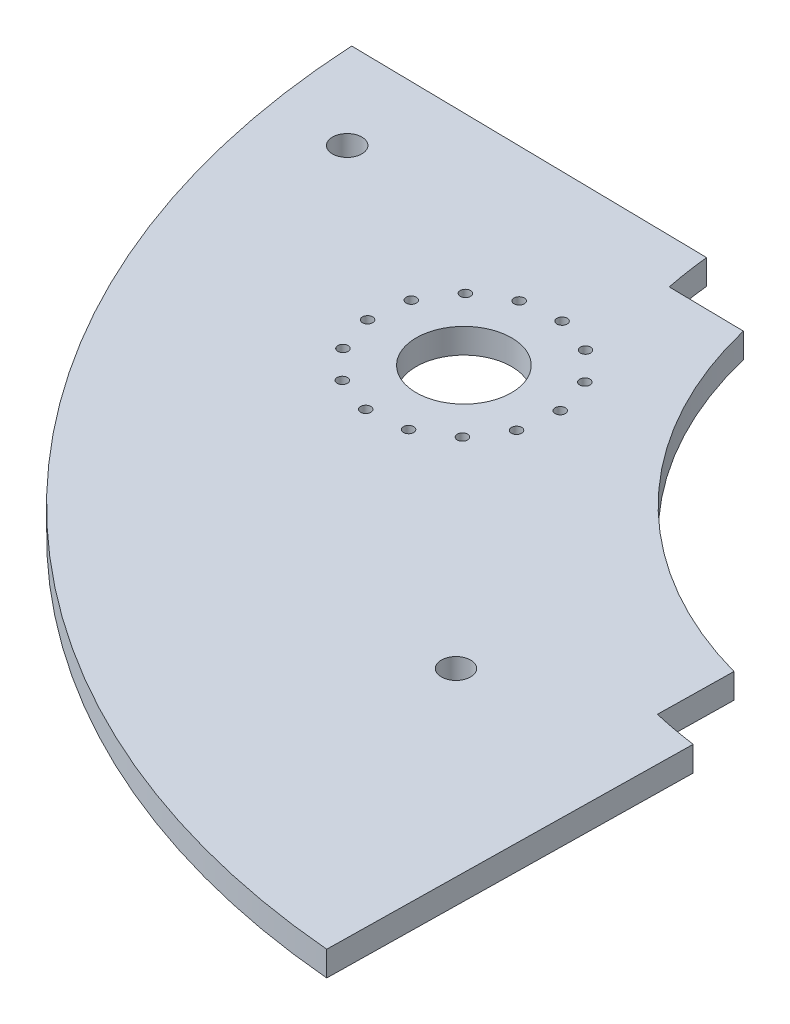
ISO-10303-21;
HEADER;
FILE_DESCRIPTION(('STEP AP214'),'2;1');
FILE_NAME('part.step','',(''),(''),'','','');
FILE_SCHEMA(('AUTOMOTIVE_DESIGN { 1 0 10303 214 1 1 1 1 }'));
ENDSEC;
DATA;
#1=APPLICATION_CONTEXT('core data for automotive mechanical design processes');
#2=APPLICATION_PROTOCOL_DEFINITION('international standard','automotive_design',2000,#1);
#3=PRODUCT_CONTEXT('',#1,'mechanical');
#4=PRODUCT('Part','Part','',(#3));
#5=PRODUCT_RELATED_PRODUCT_CATEGORY('part','',(#4));
#6=PRODUCT_DEFINITION_FORMATION('','',#4);
#7=PRODUCT_DEFINITION_CONTEXT('part definition',#1,'design');
#8=PRODUCT_DEFINITION('design','',#6,#7);
#9=PRODUCT_DEFINITION_SHAPE('','',#8);
#10=(LENGTH_UNIT() NAMED_UNIT(*) SI_UNIT(.MILLI.,.METRE.));
#11=(NAMED_UNIT(*) PLANE_ANGLE_UNIT() SI_UNIT($,.RADIAN.));
#12=(NAMED_UNIT(*) SI_UNIT($,.STERADIAN.) SOLID_ANGLE_UNIT());
#13=UNCERTAINTY_MEASURE_WITH_UNIT(LENGTH_MEASURE(1.E-05),#10,'distance_accuracy_value','');
#14=(GEOMETRIC_REPRESENTATION_CONTEXT(3) GLOBAL_UNCERTAINTY_ASSIGNED_CONTEXT((#13)) GLOBAL_UNIT_ASSIGNED_CONTEXT((#10,
#11,#12)) REPRESENTATION_CONTEXT('',''));
#15=CARTESIAN_POINT('',(0.,0.,0.));
#16=DIRECTION('',(0.,0.,1.));
#17=DIRECTION('',(1.,0.,0.));
#18=AXIS2_PLACEMENT_3D('',#15,#16,#17);
#19=CARTESIAN_POINT('',(4.07862578885082,1.7,-4.75361348173175));
#20=DIRECTION('',(0.,1.,0.));
#21=DIRECTION('',(0.,0.,1.));
#22=AXIS2_PLACEMENT_3D('',#19,#20,#21);
#23=PLANE('',#22);
#24=CARTESIAN_POINT('',(-13.0094951026305,1.7,31.5435437616723));
#25=DIRECTION('',(0.,1.,0.));
#26=DIRECTION('',(0.,0.,1.));
#27=AXIS2_PLACEMENT_3D('',#24,#25,#26);
#28=CIRCLE('',#27,0.999999999994745);
#29=CARTESIAN_POINT('',(-13.0094951026305,1.7,32.543543761667));
#30=VERTEX_POINT('',#29);
#31=EDGE_CURVE('E164',#30,#30,#28,.T.);
#32=ORIENTED_EDGE('',*,*,#31,.F.);
#33=EDGE_LOOP('',(#32));
#34=FACE_BOUND('',#33,.T.);
#35=CARTESIAN_POINT('',(-29.9103874160594,1.7,7.40792540677744));
#36=DIRECTION('',(0.,1.,0.));
#37=DIRECTION('',(0.,0.,-1.));
#38=AXIS2_PLACEMENT_3D('',#35,#36,#37);
#39=CIRCLE('',#38,0.350000000000004);
#40=CARTESIAN_POINT('',(-29.9103874160594,1.7,7.05792540677744));
#41=VERTEX_POINT('',#40);
#42=EDGE_CURVE('E181',#41,#41,#39,.T.);
#43=ORIENTED_EDGE('',*,*,#42,.F.);
#44=EDGE_LOOP('',(#43));
#45=FACE_BOUND('',#44,.T.);
#46=CARTESIAN_POINT('',(-34.8448738641863,1.7,9.06912309502029));
#47=DIRECTION('',(0.,1.,0.));
#48=DIRECTION('',(0.,0.,-1.));
#49=AXIS2_PLACEMENT_3D('',#46,#47,#48);
#50=CIRCLE('',#49,0.35);
#51=CARTESIAN_POINT('',(-34.8448738641863,1.7,8.71912309502029));
#52=VERTEX_POINT('',#51);
#53=EDGE_CURVE('E193',#52,#52,#50,.T.);
#54=ORIENTED_EDGE('',*,*,#53,.F.);
#55=EDGE_LOOP('',(#54));
#56=FACE_BOUND('',#55,.T.);
#57=CARTESIAN_POINT('',(-36.6226991907321,1.7,13.9627997674685));
#58=DIRECTION('',(0.,1.,0.));
#59=DIRECTION('',(0.,0.,-1.));
#60=AXIS2_PLACEMENT_3D('',#57,#58,#59);
#61=CIRCLE('',#60,0.349999999999987);
#62=CARTESIAN_POINT('',(-36.6226991907321,1.7,13.6127997674685));
#63=VERTEX_POINT('',#62);
#64=EDGE_CURVE('E205',#63,#63,#61,.T.);
#65=ORIENTED_EDGE('',*,*,#64,.F.);
#66=EDGE_LOOP('',(#65));
#67=FACE_BOUND('',#66,.T.);
#68=CARTESIAN_POINT('',(-33.9051246637802,1.7,18.4039170769564));
#69=DIRECTION('',(0.,1.,0.));
#70=DIRECTION('',(0.,0.,-1.));
#71=AXIS2_PLACEMENT_3D('',#68,#69,#70);
#72=CIRCLE('',#71,0.349999999999987);
#73=CARTESIAN_POINT('',(-33.9051246637802,1.7,18.0539170769564));
#74=VERTEX_POINT('',#73);
#75=EDGE_CURVE('E217',#74,#74,#72,.T.);
#76=ORIENTED_EDGE('',*,*,#75,.F.);
#77=EDGE_LOOP('',(#76));
#78=FACE_BOUND('',#77,.T.);
#79=CARTESIAN_POINT('',(-28.7385393305433,1.7,19.0482231071563));
#80=DIRECTION('',(0.,1.,0.));
#81=DIRECTION('',(0.,0.,-1.));
#82=AXIS2_PLACEMENT_3D('',#79,#80,#81);
#83=CIRCLE('',#82,0.350000000000003);
#84=CARTESIAN_POINT('',(-28.7385393305433,1.7,18.6982231071563));
#85=VERTEX_POINT('',#84);
#86=EDGE_CURVE('E229',#85,#85,#83,.T.);
#87=ORIENTED_EDGE('',*,*,#86,.F.);
#88=EDGE_LOOP('',(#87));
#89=FACE_BOUND('',#88,.T.);
#90=CARTESIAN_POINT('',(-25.0134873260829,1.7,15.4105422758798));
#91=DIRECTION('',(0.,1.,0.));
#92=DIRECTION('',(0.,0.,-1.));
#93=AXIS2_PLACEMENT_3D('',#90,#91,#92);
#94=CIRCLE('',#93,0.349999999999993);
#95=CARTESIAN_POINT('',(-25.0134873260829,1.7,15.0605422758798));
#96=VERTEX_POINT('',#95);
#97=EDGE_CURVE('E241',#96,#96,#94,.T.);
#98=ORIENTED_EDGE('',*,*,#97,.F.);
#99=EDGE_LOOP('',(#98));
#100=FACE_BOUND('',#99,.T.);
#101=CARTESIAN_POINT('',(-25.5350087869708,1.7,10.2301224442441));
#102=DIRECTION('',(0.,1.,0.));
#103=DIRECTION('',(0.,0.,-1.));
#104=AXIS2_PLACEMENT_3D('',#101,#102,#103);
#105=CIRCLE('',#104,0.350000000000001);
#106=CARTESIAN_POINT('',(-25.5350087869708,1.7,9.8801224442441));
#107=VERTEX_POINT('',#106);
#108=EDGE_CURVE('E253',#107,#107,#105,.T.);
#109=ORIENTED_EDGE('',*,*,#108,.F.);
#110=EDGE_LOOP('',(#109));
#111=FACE_BOUND('',#110,.T.);
#112=CARTESIAN_POINT('',(4.07862578885082,1.7,-4.75361348173175));
#113=DIRECTION('',(0.,1.,0.));
#114=DIRECTION('',(0.,0.,1.));
#115=AXIS2_PLACEMENT_3D('',#112,#113,#114);
#116=CIRCLE('',#115,57.5);
#117=CARTESIAN_POINT('',(-53.3385810768644,1.7,-1.66907855087679));
#118=VERTEX_POINT('',#117);
#119=CARTESIAN_POINT('',(-0.835821487659761,1.7,52.5359859929233));
#120=VERTEX_POINT('',#119);
#121=EDGE_CURVE('E150',#118,#120,#116,.T.);
#122=ORIENTED_EDGE('',*,*,#121,.T.);
#123=DIRECTION('',(0.0159509238825516,0.,-0.999872775920663));
#124=VECTOR('',#123,1.);
#125=CARTESIAN_POINT('',(-0.443364603551709,1.7,27.9350940927658));
#126=LINE('',#125,#124);
#127=CARTESIAN_POINT('',(-0.443364603551709,1.7,27.9350940927658));
#128=VERTEX_POINT('',#127);
#129=EDGE_CURVE('E97',#120,#128,#126,.T.);
#130=ORIENTED_EDGE('',*,*,#129,.T.);
#131=CARTESIAN_POINT('',(4.07862578885082,1.7,-4.75361348173175));
#132=DIRECTION('',(0.,-1.,0.));
#133=DIRECTION('',(0.,0.,1.));
#134=AXIS2_PLACEMENT_3D('',#131,#132,#133);
#135=CIRCLE('',#134,32.9999999999999);
#136=CARTESIAN_POINT('',(-3.43488548125061,1.7,27.3796581910073));
#137=VERTEX_POINT('',#136);
#138=EDGE_CURVE('E265',#128,#137,#135,.T.);
#139=ORIENTED_EDGE('',*,*,#138,.T.);
#140=DIRECTION('',(0.0159509238825519,0.,-0.999872775920663));
#141=VECTOR('',#140,1.);
#142=CARTESIAN_POINT('',(-3.362528612068,1.7,22.8440172350829));
#143=LINE('',#142,#141);
#144=CARTESIAN_POINT('',(-3.35292728046834,1.7,22.2421643173591));
#145=VERTEX_POINT('',#144);
#146=EDGE_CURVE('E267',#137,#145,#143,.T.);
#147=ORIENTED_EDGE('',*,*,#146,.T.);
#148=CARTESIAN_POINT('',(4.07862578885082,1.7,-4.75361348173175));
#149=DIRECTION('',(0.,-1.,0.));
#150=DIRECTION('',(0.,0.,1.));
#151=AXIS2_PLACEMENT_3D('',#148,#149,#150);
#152=CIRCLE('',#151,27.9999999999999);
#153=CARTESIAN_POINT('',(-23.1404649445951,1.7,1.81305231183759));
#154=VERTEX_POINT('',#153);
#155=EDGE_CURVE('E116',#145,#154,#152,.T.);
#156=ORIENTED_EDGE('',*,*,#155,.T.);
#157=DIRECTION('',(-0.999872775920664,0.,-0.0159509238825176));
#158=VECTOR('',#157,1.);
#159=CARTESIAN_POINT('',(-23.7423178623191,1.7,1.80345098023794));
#160=LINE('',#159,#158);
#161=CARTESIAN_POINT('',(-28.2779588182433,1.7,1.7310941110555));
#162=VERTEX_POINT('',#161);
#163=EDGE_CURVE('E110',#154,#162,#160,.T.);
#164=ORIENTED_EDGE('',*,*,#163,.T.);
#165=CARTESIAN_POINT('',(4.07862578885082,1.7,-4.75361348173175));
#166=DIRECTION('',(0.,-1.,0.));
#167=DIRECTION('',(0.,0.,1.));
#168=AXIS2_PLACEMENT_3D('',#165,#166,#167);
#169=CIRCLE('',#168,32.9999999999999);
#170=CARTESIAN_POINT('',(-28.7376891767068,1.7,-1.27662166676958));
#171=VERTEX_POINT('',#170);
#172=EDGE_CURVE('E114',#162,#171,#169,.T.);
#173=ORIENTED_EDGE('',*,*,#172,.T.);
#174=DIRECTION('',(-0.999872775920664,0.,-0.0159509238825177));
#175=VECTOR('',#174,1.);
#176=CARTESIAN_POINT('',(-53.3385810768644,1.7,-1.66907855087679));
#177=LINE('',#176,#175);
#178=EDGE_CURVE('E54',#171,#118,#177,.T.);
#179=ORIENTED_EDGE('',*,*,#178,.T.);
#180=EDGE_LOOP('',(#122,#130,#139,#147,#156,#164,#173,#179));
#181=FACE_BOUND('',#180,.T.);
#182=CARTESIAN_POINT('',(-27.4006240728926,1.7,8.31969811547301));
#183=DIRECTION('',(0.,1.,0.));
#184=DIRECTION('',(0.,0.,-1.));
#185=AXIS2_PLACEMENT_3D('',#182,#183,#184);
#186=CIRCLE('',#185,0.350000000000001);
#187=CARTESIAN_POINT('',(-27.4006240728926,1.7,7.96969811547301));
#188=VERTEX_POINT('',#187);
#189=EDGE_CURVE('E137',#188,#188,#186,.T.);
#190=ORIENTED_EDGE('',*,*,#189,.F.);
#191=EDGE_LOOP('',(#190));
#192=FACE_BOUND('',#191,.T.);
#193=CARTESIAN_POINT('',(-24.6830495459407,1.7,12.7608154249609));
#194=DIRECTION('',(0.,1.,0.));
#195=DIRECTION('',(0.,0.,-1.));
#196=AXIS2_PLACEMENT_3D('',#193,#194,#195);
#197=CIRCLE('',#196,0.350000000000004);
#198=CARTESIAN_POINT('',(-24.6830495459407,1.7,12.4108154249609));
#199=VERTEX_POINT('',#198);
#200=EDGE_CURVE('E247',#199,#199,#197,.T.);
#201=ORIENTED_EDGE('',*,*,#200,.F.);
#202=EDGE_LOOP('',(#201));
#203=FACE_BOUND('',#202,.T.);
#204=CARTESIAN_POINT('',(-26.4608748724866,1.7,17.6544920974091));
#205=DIRECTION('',(0.,1.,0.));
#206=DIRECTION('',(0.,0.,-1.));
#207=AXIS2_PLACEMENT_3D('',#204,#205,#206);
#208=CIRCLE('',#207,0.349999999999998);
#209=CARTESIAN_POINT('',(-26.4608748724866,1.7,17.3044920974091));
#210=VERTEX_POINT('',#209);
#211=EDGE_CURVE('E235',#210,#210,#208,.T.);
#212=ORIENTED_EDGE('',*,*,#211,.F.);
#213=EDGE_LOOP('',(#212));
#214=FACE_BOUND('',#213,.T.);
#215=CARTESIAN_POINT('',(-31.3953613206134,1.7,19.315689785652));
#216=DIRECTION('',(0.,1.,0.));
#217=DIRECTION('',(0.,0.,-1.));
#218=AXIS2_PLACEMENT_3D('',#215,#216,#217);
#219=CIRCLE('',#218,0.35);
#220=CARTESIAN_POINT('',(-31.3953613206134,1.7,18.965689785652));
#221=VERTEX_POINT('',#220);
#222=EDGE_CURVE('E223',#221,#221,#219,.T.);
#223=ORIENTED_EDGE('',*,*,#222,.F.);
#224=EDGE_LOOP('',(#223));
#225=FACE_BOUND('',#224,.T.);
#226=CARTESIAN_POINT('',(-35.770739949702,1.7,16.4934927481853));
#227=DIRECTION('',(0.,1.,0.));
#228=DIRECTION('',(0.,0.,-1.));
#229=AXIS2_PLACEMENT_3D('',#226,#227,#228);
#230=CIRCLE('',#229,0.35);
#231=CARTESIAN_POINT('',(-35.770739949702,1.7,16.1434927481853));
#232=VERTEX_POINT('',#231);
#233=EDGE_CURVE('E211',#232,#232,#230,.T.);
#234=ORIENTED_EDGE('',*,*,#233,.F.);
#235=EDGE_LOOP('',(#234));
#236=FACE_BOUND('',#235,.T.);
#237=CARTESIAN_POINT('',(-36.29226141059,1.7,11.3130729165496));
#238=DIRECTION('',(0.,1.,0.));
#239=DIRECTION('',(0.,0.,-1.));
#240=AXIS2_PLACEMENT_3D('',#237,#238,#239);
#241=CIRCLE('',#240,0.349999999999993);
#242=CARTESIAN_POINT('',(-36.29226141059,1.7,10.9630729165496));
#243=VERTEX_POINT('',#242);
#244=EDGE_CURVE('E199',#243,#243,#241,.T.);
#245=ORIENTED_EDGE('',*,*,#244,.F.);
#246=EDGE_LOOP('',(#245));
#247=FACE_BOUND('',#246,.T.);
#248=CARTESIAN_POINT('',(-32.5672094061295,1.7,7.67539208527307));
#249=DIRECTION('',(0.,1.,0.));
#250=DIRECTION('',(0.,0.,-1.));
#251=AXIS2_PLACEMENT_3D('',#248,#249,#250);
#252=CIRCLE('',#251,0.349999999999994);
#253=CARTESIAN_POINT('',(-32.5672094061295,1.7,7.32539208527307));
#254=VERTEX_POINT('',#253);
#255=EDGE_CURVE('E187',#254,#254,#252,.T.);
#256=ORIENTED_EDGE('',*,*,#255,.F.);
#257=EDGE_LOOP('',(#256));
#258=FACE_BOUND('',#257,.T.);
#259=CARTESIAN_POINT('',(-30.6528743683364,1.7,13.3618075962147));
#260=DIRECTION('',(0.,1.,0.));
#261=DIRECTION('',(0.,0.,-1.));
#262=AXIS2_PLACEMENT_3D('',#259,#260,#261);
#263=CIRCLE('',#262,3.25);
#264=CARTESIAN_POINT('',(-30.6528743683364,1.7,10.1118075962147));
#265=VERTEX_POINT('',#264);
#266=EDGE_CURVE('E168',#265,#265,#263,.T.);
#267=ORIENTED_EDGE('',*,*,#266,.F.);
#268=EDGE_LOOP('',(#267));
#269=FACE_BOUND('',#268,.T.);
#270=CARTESIAN_POINT('',(-47.6153672350513,1.7,4.36135761284235));
#271=DIRECTION('',(0.,1.,0.));
#272=DIRECTION('',(0.,0.,1.));
#273=AXIS2_PLACEMENT_3D('',#270,#271,#272);
#274=CIRCLE('',#273,0.999999999998277);
#275=CARTESIAN_POINT('',(-47.6153672350513,1.7,5.36135761284063));
#276=VERTEX_POINT('',#275);
#277=EDGE_CURVE('E175',#276,#276,#274,.T.);
#278=ORIENTED_EDGE('',*,*,#277,.F.);
#279=EDGE_LOOP('',(#278));
#280=FACE_BOUND('',#279,.T.);
#281=ADVANCED_FACE('F35',(#34,#45,#56,#67,#78,#89,#100,#111,#181,#192,#203,#214,#225,#236,#247,
#258,#269,#280),#23,.T.);
#282=CARTESIAN_POINT('',(4.07862578885082,0.,-4.75361348173175));
#283=DIRECTION('',(0.,1.,0.));
#284=DIRECTION('',(0.,0.,1.));
#285=AXIS2_PLACEMENT_3D('',#282,#283,#284);
#286=PLANE('',#285);
#287=CARTESIAN_POINT('',(-13.0094951026305,0.,31.5435437616723));
#288=DIRECTION('',(0.,1.,0.));
#289=DIRECTION('',(0.,0.,1.));
#290=AXIS2_PLACEMENT_3D('',#287,#288,#289);
#291=CIRCLE('',#290,0.999999999994745);
#292=CARTESIAN_POINT('',(-13.0094951026305,0.,32.543543761667));
#293=VERTEX_POINT('',#292);
#294=EDGE_CURVE('E161',#293,#293,#291,.F.);
#295=ORIENTED_EDGE('',*,*,#294,.F.);
#296=EDGE_LOOP('',(#295));
#297=FACE_BOUND('',#296,.T.);
#298=CARTESIAN_POINT('',(-29.9103874160594,0.,7.40792540677744));
#299=DIRECTION('',(0.,1.,0.));
#300=DIRECTION('',(0.,0.,-1.));
#301=AXIS2_PLACEMENT_3D('',#298,#299,#300);
#302=CIRCLE('',#301,0.350000000000004);
#303=CARTESIAN_POINT('',(-29.9103874160594,0.,7.05792540677744));
#304=VERTEX_POINT('',#303);
#305=EDGE_CURVE('E179',#304,#304,#302,.T.);
#306=ORIENTED_EDGE('',*,*,#305,.T.);
#307=EDGE_LOOP('',(#306));
#308=FACE_BOUND('',#307,.T.);
#309=CARTESIAN_POINT('',(-34.8448738641863,0.,9.06912309502029));
#310=DIRECTION('',(0.,1.,0.));
#311=DIRECTION('',(0.,0.,-1.));
#312=AXIS2_PLACEMENT_3D('',#309,#310,#311);
#313=CIRCLE('',#312,0.35);
#314=CARTESIAN_POINT('',(-34.8448738641863,0.,8.71912309502029));
#315=VERTEX_POINT('',#314);
#316=EDGE_CURVE('E190',#315,#315,#313,.T.);
#317=ORIENTED_EDGE('',*,*,#316,.T.);
#318=EDGE_LOOP('',(#317));
#319=FACE_BOUND('',#318,.T.);
#320=CARTESIAN_POINT('',(-36.6226991907321,0.,13.9627997674685));
#321=DIRECTION('',(0.,1.,0.));
#322=DIRECTION('',(0.,0.,-1.));
#323=AXIS2_PLACEMENT_3D('',#320,#321,#322);
#324=CIRCLE('',#323,0.349999999999987);
#325=CARTESIAN_POINT('',(-36.6226991907321,0.,13.6127997674685));
#326=VERTEX_POINT('',#325);
#327=EDGE_CURVE('E202',#326,#326,#324,.T.);
#328=ORIENTED_EDGE('',*,*,#327,.T.);
#329=EDGE_LOOP('',(#328));
#330=FACE_BOUND('',#329,.T.);
#331=CARTESIAN_POINT('',(-33.9051246637802,0.,18.4039170769564));
#332=DIRECTION('',(0.,1.,0.));
#333=DIRECTION('',(0.,0.,-1.));
#334=AXIS2_PLACEMENT_3D('',#331,#332,#333);
#335=CIRCLE('',#334,0.349999999999987);
#336=CARTESIAN_POINT('',(-33.9051246637802,0.,18.0539170769564));
#337=VERTEX_POINT('',#336);
#338=EDGE_CURVE('E214',#337,#337,#335,.T.);
#339=ORIENTED_EDGE('',*,*,#338,.T.);
#340=EDGE_LOOP('',(#339));
#341=FACE_BOUND('',#340,.T.);
#342=CARTESIAN_POINT('',(-28.7385393305433,0.,19.0482231071563));
#343=DIRECTION('',(0.,1.,0.));
#344=DIRECTION('',(0.,0.,-1.));
#345=AXIS2_PLACEMENT_3D('',#342,#343,#344);
#346=CIRCLE('',#345,0.350000000000003);
#347=CARTESIAN_POINT('',(-28.7385393305433,0.,18.6982231071563));
#348=VERTEX_POINT('',#347);
#349=EDGE_CURVE('E226',#348,#348,#346,.T.);
#350=ORIENTED_EDGE('',*,*,#349,.T.);
#351=EDGE_LOOP('',(#350));
#352=FACE_BOUND('',#351,.T.);
#353=CARTESIAN_POINT('',(-25.0134873260829,0.,15.4105422758798));
#354=DIRECTION('',(0.,1.,0.));
#355=DIRECTION('',(0.,0.,-1.));
#356=AXIS2_PLACEMENT_3D('',#353,#354,#355);
#357=CIRCLE('',#356,0.349999999999993);
#358=CARTESIAN_POINT('',(-25.0134873260829,0.,15.0605422758798));
#359=VERTEX_POINT('',#358);
#360=EDGE_CURVE('E238',#359,#359,#357,.T.);
#361=ORIENTED_EDGE('',*,*,#360,.T.);
#362=EDGE_LOOP('',(#361));
#363=FACE_BOUND('',#362,.T.);
#364=CARTESIAN_POINT('',(-25.5350087869708,0.,10.2301224442441));
#365=DIRECTION('',(0.,1.,0.));
#366=DIRECTION('',(0.,0.,-1.));
#367=AXIS2_PLACEMENT_3D('',#364,#365,#366);
#368=CIRCLE('',#367,0.350000000000001);
#369=CARTESIAN_POINT('',(-25.5350087869708,0.,9.8801224442441));
#370=VERTEX_POINT('',#369);
#371=EDGE_CURVE('E250',#370,#370,#368,.T.);
#372=ORIENTED_EDGE('',*,*,#371,.T.);
#373=EDGE_LOOP('',(#372));
#374=FACE_BOUND('',#373,.T.);
#375=CARTESIAN_POINT('',(4.07862578885082,0.,-4.75361348173175));
#376=DIRECTION('',(0.,1.,0.));
#377=DIRECTION('',(0.,0.,1.));
#378=AXIS2_PLACEMENT_3D('',#375,#376,#377);
#379=CIRCLE('',#378,57.5);
#380=CARTESIAN_POINT('',(-53.3385810768644,0.,-1.66907855087679));
#381=VERTEX_POINT('',#380);
#382=CARTESIAN_POINT('',(-0.835821487659761,0.,52.5359859929233));
#383=VERTEX_POINT('',#382);
#384=EDGE_CURVE('E133',#381,#383,#379,.T.);
#385=ORIENTED_EDGE('',*,*,#384,.F.);
#386=DIRECTION('',(-0.999872775920664,0.,-0.0159509238825177));
#387=VECTOR('',#386,1.);
#388=CARTESIAN_POINT('',(-53.3385810768644,0.,-1.66907855087679));
#389=LINE('',#388,#387);
#390=CARTESIAN_POINT('',(-28.7376891767068,0.,-1.27662166676958));
#391=VERTEX_POINT('',#390);
#392=EDGE_CURVE('E89',#391,#381,#389,.T.);
#393=ORIENTED_EDGE('',*,*,#392,.F.);
#394=CARTESIAN_POINT('',(4.07862578885082,0.,-4.75361348173175));
#395=DIRECTION('',(0.,-1.,0.));
#396=DIRECTION('',(0.,0.,1.));
#397=AXIS2_PLACEMENT_3D('',#394,#395,#396);
#398=CIRCLE('',#397,32.9999999999999);
#399=CARTESIAN_POINT('',(-28.2779588182433,0.,1.7310941110555));
#400=VERTEX_POINT('',#399);
#401=EDGE_CURVE('E83',#400,#391,#398,.T.);
#402=ORIENTED_EDGE('',*,*,#401,.F.);
#403=DIRECTION('',(-0.999872775920664,0.,-0.0159509238825177));
#404=VECTOR('',#403,1.);
#405=CARTESIAN_POINT('',(-28.2779588182433,0.,1.7310941110555));
#406=LINE('',#405,#404);
#407=CARTESIAN_POINT('',(-23.1404649445951,0.,1.81305231183759));
#408=VERTEX_POINT('',#407);
#409=EDGE_CURVE('E123',#408,#400,#406,.T.);
#410=ORIENTED_EDGE('',*,*,#409,.F.);
#411=CARTESIAN_POINT('',(4.07862578885082,0.,-4.75361348173175));
#412=DIRECTION('',(0.,-1.,0.));
#413=DIRECTION('',(0.,0.,1.));
#414=AXIS2_PLACEMENT_3D('',#411,#412,#413);
#415=CIRCLE('',#414,27.9999999999999);
#416=CARTESIAN_POINT('',(-3.35292728046834,0.,22.2421643173591));
#417=VERTEX_POINT('',#416);
#418=EDGE_CURVE('E144',#417,#408,#415,.T.);
#419=ORIENTED_EDGE('',*,*,#418,.F.);
#420=DIRECTION('',(0.0159509238825209,0.,-0.999872775920664));
#421=VECTOR('',#420,1.);
#422=CARTESIAN_POINT('',(-3.362528612068,0.,22.8440172350829));
#423=LINE('',#422,#421);
#424=CARTESIAN_POINT('',(-3.43488548125061,0.,27.3796581910073));
#425=VERTEX_POINT('',#424);
#426=EDGE_CURVE('E142',#425,#417,#423,.T.);
#427=ORIENTED_EDGE('',*,*,#426,.F.);
#428=CARTESIAN_POINT('',(4.07862578885082,0.,-4.75361348173175));
#429=DIRECTION('',(0.,-1.,0.));
#430=DIRECTION('',(0.,0.,1.));
#431=AXIS2_PLACEMENT_3D('',#428,#429,#430);
#432=CIRCLE('',#431,32.9999999999999);
#433=CARTESIAN_POINT('',(-0.443364603551709,0.,27.9350940927658));
#434=VERTEX_POINT('',#433);
#435=EDGE_CURVE('E139',#434,#425,#432,.T.);
#436=ORIENTED_EDGE('',*,*,#435,.F.);
#437=DIRECTION('',(0.0159509238825516,0.,-0.999872775920663));
#438=VECTOR('',#437,1.);
#439=CARTESIAN_POINT('',(-0.443364603551709,0.,27.9350940927658));
#440=LINE('',#439,#438);
#441=EDGE_CURVE('E136',#383,#434,#440,.T.);
#442=ORIENTED_EDGE('',*,*,#441,.F.);
#443=EDGE_LOOP('',(#385,#393,#402,#410,#419,#427,#436,#442));
#444=FACE_BOUND('',#443,.T.);
#445=CARTESIAN_POINT('',(-27.4006240728926,0.,8.31969811547301));
#446=DIRECTION('',(0.,1.,0.));
#447=DIRECTION('',(0.,0.,-1.));
#448=AXIS2_PLACEMENT_3D('',#445,#446,#447);
#449=CIRCLE('',#448,0.350000000000001);
#450=CARTESIAN_POINT('',(-27.4006240728926,0.,7.96969811547301));
#451=VERTEX_POINT('',#450);
#452=EDGE_CURVE('E256',#451,#451,#449,.T.);
#453=ORIENTED_EDGE('',*,*,#452,.T.);
#454=EDGE_LOOP('',(#453));
#455=FACE_BOUND('',#454,.T.);
#456=CARTESIAN_POINT('',(-24.6830495459407,0.,12.7608154249609));
#457=DIRECTION('',(0.,1.,0.));
#458=DIRECTION('',(0.,0.,-1.));
#459=AXIS2_PLACEMENT_3D('',#456,#457,#458);
#460=CIRCLE('',#459,0.350000000000004);
#461=CARTESIAN_POINT('',(-24.6830495459407,0.,12.4108154249609));
#462=VERTEX_POINT('',#461);
#463=EDGE_CURVE('E244',#462,#462,#460,.T.);
#464=ORIENTED_EDGE('',*,*,#463,.T.);
#465=EDGE_LOOP('',(#464));
#466=FACE_BOUND('',#465,.T.);
#467=CARTESIAN_POINT('',(-26.4608748724866,0.,17.6544920974091));
#468=DIRECTION('',(0.,1.,0.));
#469=DIRECTION('',(0.,0.,-1.));
#470=AXIS2_PLACEMENT_3D('',#467,#468,#469);
#471=CIRCLE('',#470,0.349999999999998);
#472=CARTESIAN_POINT('',(-26.4608748724866,0.,17.3044920974091));
#473=VERTEX_POINT('',#472);
#474=EDGE_CURVE('E232',#473,#473,#471,.T.);
#475=ORIENTED_EDGE('',*,*,#474,.T.);
#476=EDGE_LOOP('',(#475));
#477=FACE_BOUND('',#476,.T.);
#478=CARTESIAN_POINT('',(-31.3953613206134,0.,19.315689785652));
#479=DIRECTION('',(0.,1.,0.));
#480=DIRECTION('',(0.,0.,-1.));
#481=AXIS2_PLACEMENT_3D('',#478,#479,#480);
#482=CIRCLE('',#481,0.35);
#483=CARTESIAN_POINT('',(-31.3953613206134,0.,18.965689785652));
#484=VERTEX_POINT('',#483);
#485=EDGE_CURVE('E220',#484,#484,#482,.T.);
#486=ORIENTED_EDGE('',*,*,#485,.T.);
#487=EDGE_LOOP('',(#486));
#488=FACE_BOUND('',#487,.T.);
#489=CARTESIAN_POINT('',(-35.770739949702,0.,16.4934927481853));
#490=DIRECTION('',(0.,1.,0.));
#491=DIRECTION('',(0.,0.,-1.));
#492=AXIS2_PLACEMENT_3D('',#489,#490,#491);
#493=CIRCLE('',#492,0.35);
#494=CARTESIAN_POINT('',(-35.770739949702,0.,16.1434927481853));
#495=VERTEX_POINT('',#494);
#496=EDGE_CURVE('E208',#495,#495,#493,.T.);
#497=ORIENTED_EDGE('',*,*,#496,.T.);
#498=EDGE_LOOP('',(#497));
#499=FACE_BOUND('',#498,.T.);
#500=CARTESIAN_POINT('',(-36.29226141059,0.,11.3130729165496));
#501=DIRECTION('',(0.,1.,0.));
#502=DIRECTION('',(0.,0.,-1.));
#503=AXIS2_PLACEMENT_3D('',#500,#501,#502);
#504=CIRCLE('',#503,0.349999999999993);
#505=CARTESIAN_POINT('',(-36.29226141059,0.,10.9630729165496));
#506=VERTEX_POINT('',#505);
#507=EDGE_CURVE('E196',#506,#506,#504,.T.);
#508=ORIENTED_EDGE('',*,*,#507,.T.);
#509=EDGE_LOOP('',(#508));
#510=FACE_BOUND('',#509,.T.);
#511=CARTESIAN_POINT('',(-32.5672094061295,0.,7.67539208527307));
#512=DIRECTION('',(0.,1.,0.));
#513=DIRECTION('',(0.,0.,-1.));
#514=AXIS2_PLACEMENT_3D('',#511,#512,#513);
#515=CIRCLE('',#514,0.349999999999994);
#516=CARTESIAN_POINT('',(-32.5672094061295,0.,7.32539208527307));
#517=VERTEX_POINT('',#516);
#518=EDGE_CURVE('E184',#517,#517,#515,.T.);
#519=ORIENTED_EDGE('',*,*,#518,.T.);
#520=EDGE_LOOP('',(#519));
#521=FACE_BOUND('',#520,.T.);
#522=CARTESIAN_POINT('',(-30.6528743683364,0.,13.3618075962147));
#523=DIRECTION('',(0.,1.,0.));
#524=DIRECTION('',(0.,0.,-1.));
#525=AXIS2_PLACEMENT_3D('',#522,#523,#524);
#526=CIRCLE('',#525,3.25);
#527=CARTESIAN_POINT('',(-30.6528743683364,0.,10.1118075962147));
#528=VERTEX_POINT('',#527);
#529=EDGE_CURVE('E163',#528,#528,#526,.T.);
#530=ORIENTED_EDGE('',*,*,#529,.T.);
#531=EDGE_LOOP('',(#530));
#532=FACE_BOUND('',#531,.T.);
#533=CARTESIAN_POINT('',(-47.6153672350513,0.,4.36135761284235));
#534=DIRECTION('',(0.,1.,0.));
#535=DIRECTION('',(0.,0.,1.));
#536=AXIS2_PLACEMENT_3D('',#533,#534,#535);
#537=CIRCLE('',#536,0.999999999998277);
#538=CARTESIAN_POINT('',(-47.6153672350513,0.,5.36135761284063));
#539=VERTEX_POINT('',#538);
#540=EDGE_CURVE('E39',#539,#539,#537,.F.);
#541=ORIENTED_EDGE('',*,*,#540,.F.);
#542=EDGE_LOOP('',(#541));
#543=FACE_BOUND('',#542,.T.);
#544=ADVANCED_FACE('F279',(#297,#308,#319,#330,#341,#352,#363,#374,#444,#455,#466,#477,#488,
#499,#510,#521,#532,#543),#286,.F.);
#545=CARTESIAN_POINT('',(4.07862578885082,1.7,-4.75361348173175));
#546=DIRECTION('',(0.,-1.,0.));
#547=DIRECTION('',(0.,0.,-1.));
#548=AXIS2_PLACEMENT_3D('',#545,#546,#547);
#549=CYLINDRICAL_SURFACE('',#548,57.5);
#550=ORIENTED_EDGE('',*,*,#384,.T.);
#551=DIRECTION('',(0.,-1.,0.));
#552=VECTOR('',#551,1.);
#553=CARTESIAN_POINT('',(-0.835821487659761,1.7,52.5359859929233));
#554=LINE('',#553,#552);
#555=EDGE_CURVE('E11',#120,#383,#554,.T.);
#556=ORIENTED_EDGE('',*,*,#555,.F.);
#557=ORIENTED_EDGE('',*,*,#121,.F.);
#558=DIRECTION('',(0.,-1.,0.));
#559=VECTOR('',#558,1.);
#560=CARTESIAN_POINT('',(-53.3385810768644,1.7,-1.66907855087679));
#561=LINE('',#560,#559);
#562=EDGE_CURVE('E129',#118,#381,#561,.T.);
#563=ORIENTED_EDGE('',*,*,#562,.T.);
#564=EDGE_LOOP('',(#550,#556,#557,#563));
#565=FACE_BOUND('',#564,.T.);
#566=ADVANCED_FACE('F37',(#565),#549,.T.);
#567=CARTESIAN_POINT('',(-0.443364603551709,1.7,27.9350940927658));
#568=DIRECTION('',(-0.999872775920663,0.,-0.0159509238825516));
#569=DIRECTION('',(-0.0159509238825516,0.,0.999872775920663));
#570=AXIS2_PLACEMENT_3D('',#567,#568,#569);
#571=PLANE('',#570);
#572=ORIENTED_EDGE('',*,*,#441,.T.);
#573=DIRECTION('',(0.,-1.,0.));
#574=VECTOR('',#573,1.);
#575=CARTESIAN_POINT('',(-0.443364603551709,1.7,27.9350940927658));
#576=LINE('',#575,#574);
#577=EDGE_CURVE('E45',#128,#434,#576,.T.);
#578=ORIENTED_EDGE('',*,*,#577,.F.);
#579=ORIENTED_EDGE('',*,*,#129,.F.);
#580=ORIENTED_EDGE('',*,*,#555,.T.);
#581=EDGE_LOOP('',(#572,#578,#579,#580));
#582=FACE_BOUND('',#581,.T.);
#583=ADVANCED_FACE('F487',(#582),#571,.F.);
#584=CARTESIAN_POINT('',(4.07862578885082,1.7,-4.75361348173175));
#585=DIRECTION('',(0.,-1.,0.));
#586=DIRECTION('',(0.,0.,-1.));
#587=AXIS2_PLACEMENT_3D('',#584,#585,#586);
#588=CYLINDRICAL_SURFACE('',#587,32.9999999999999);
#589=ORIENTED_EDGE('',*,*,#435,.T.);
#590=DIRECTION('',(0.,-1.,0.));
#591=VECTOR('',#590,1.);
#592=CARTESIAN_POINT('',(-3.43488548125061,1.7,27.3796581910073));
#593=LINE('',#592,#591);
#594=EDGE_CURVE('E157',#137,#425,#593,.T.);
#595=ORIENTED_EDGE('',*,*,#594,.F.);
#596=ORIENTED_EDGE('',*,*,#138,.F.);
#597=ORIENTED_EDGE('',*,*,#577,.T.);
#598=EDGE_LOOP('',(#589,#595,#596,#597));
#599=FACE_BOUND('',#598,.T.);
#600=ADVANCED_FACE('F477',(#599),#588,.F.);
#601=CARTESIAN_POINT('',(-3.362528612068,1.7,22.8440172350829));
#602=DIRECTION('',(-0.999872775920664,0.,-0.0159509238825209));
#603=DIRECTION('',(-0.0159509238825209,0.,0.999872775920664));
#604=AXIS2_PLACEMENT_3D('',#601,#602,#603);
#605=PLANE('',#604);
#606=ORIENTED_EDGE('',*,*,#426,.T.);
#607=DIRECTION('',(0.,-1.,0.));
#608=VECTOR('',#607,1.);
#609=CARTESIAN_POINT('',(-3.35292728046834,1.7,22.2421643173591));
#610=LINE('',#609,#608);
#611=EDGE_CURVE('E154',#145,#417,#610,.T.);
#612=ORIENTED_EDGE('',*,*,#611,.F.);
#613=ORIENTED_EDGE('',*,*,#146,.F.);
#614=ORIENTED_EDGE('',*,*,#594,.T.);
#615=EDGE_LOOP('',(#606,#612,#613,#614));
#616=FACE_BOUND('',#615,.T.);
#617=ADVANCED_FACE('F273',(#616),#605,.F.);
#618=CARTESIAN_POINT('',(4.07862578885082,1.7,-4.75361348173175));
#619=DIRECTION('',(0.,-1.,0.));
#620=DIRECTION('',(0.,0.,-1.));
#621=AXIS2_PLACEMENT_3D('',#618,#619,#620);
#622=CYLINDRICAL_SURFACE('',#621,27.9999999999999);
#623=ORIENTED_EDGE('',*,*,#418,.T.);
#624=DIRECTION('',(0.,-1.,0.));
#625=VECTOR('',#624,1.);
#626=CARTESIAN_POINT('',(-23.1404649445951,1.7,1.81305231183759));
#627=LINE('',#626,#625);
#628=EDGE_CURVE('E124',#154,#408,#627,.T.);
#629=ORIENTED_EDGE('',*,*,#628,.F.);
#630=ORIENTED_EDGE('',*,*,#155,.F.);
#631=ORIENTED_EDGE('',*,*,#611,.T.);
#632=EDGE_LOOP('',(#623,#629,#630,#631));
#633=FACE_BOUND('',#632,.T.);
#634=ADVANCED_FACE('F276',(#633),#622,.F.);
#635=CARTESIAN_POINT('',(-28.2779588182433,1.7,1.7310941110555));
#636=DIRECTION('',(-0.0159509238825177,0.,0.999872775920664));
#637=DIRECTION('',(0.999872775920664,0.,0.0159509238825177));
#638=AXIS2_PLACEMENT_3D('',#635,#636,#637);
#639=PLANE('',#638);
#640=ORIENTED_EDGE('',*,*,#409,.T.);
#641=DIRECTION('',(0.,-1.,0.));
#642=VECTOR('',#641,1.);
#643=CARTESIAN_POINT('',(-28.2779588182433,1.7,1.7310941110555));
#644=LINE('',#643,#642);
#645=EDGE_CURVE('E121',#162,#400,#644,.T.);
#646=ORIENTED_EDGE('',*,*,#645,.F.);
#647=ORIENTED_EDGE('',*,*,#163,.F.);
#648=ORIENTED_EDGE('',*,*,#628,.T.);
#649=EDGE_LOOP('',(#640,#646,#647,#648));
#650=FACE_BOUND('',#649,.T.);
#651=ADVANCED_FACE('F122',(#650),#639,.F.);
#652=CARTESIAN_POINT('',(4.07862578885082,1.7,-4.75361348173175));
#653=DIRECTION('',(0.,-1.,0.));
#654=DIRECTION('',(0.,0.,-1.));
#655=AXIS2_PLACEMENT_3D('',#652,#653,#654);
#656=CYLINDRICAL_SURFACE('',#655,32.9999999999999);
#657=ORIENTED_EDGE('',*,*,#401,.T.);
#658=DIRECTION('',(0.,-1.,0.));
#659=VECTOR('',#658,1.);
#660=CARTESIAN_POINT('',(-28.7376891767068,1.7,-1.27662166676958));
#661=LINE('',#660,#659);
#662=EDGE_CURVE('E125',#171,#391,#661,.T.);
#663=ORIENTED_EDGE('',*,*,#662,.F.);
#664=ORIENTED_EDGE('',*,*,#172,.F.);
#665=ORIENTED_EDGE('',*,*,#645,.T.);
#666=EDGE_LOOP('',(#657,#663,#664,#665));
#667=FACE_BOUND('',#666,.T.);
#668=ADVANCED_FACE('F127',(#667),#656,.F.);
#669=CARTESIAN_POINT('',(-53.3385810768644,1.7,-1.66907855087679));
#670=DIRECTION('',(-0.0159509238825177,0.,0.999872775920664));
#671=DIRECTION('',(0.999872775920664,0.,0.0159509238825177));
#672=AXIS2_PLACEMENT_3D('',#669,#670,#671);
#673=PLANE('',#672);
#674=ORIENTED_EDGE('',*,*,#392,.T.);
#675=ORIENTED_EDGE('',*,*,#562,.F.);
#676=ORIENTED_EDGE('',*,*,#178,.F.);
#677=ORIENTED_EDGE('',*,*,#662,.T.);
#678=EDGE_LOOP('',(#674,#675,#676,#677));
#679=FACE_BOUND('',#678,.T.);
#680=ADVANCED_FACE('F285',(#679),#673,.F.);
#681=CARTESIAN_POINT('',(-27.4006240728926,1.7,8.31969811547301));
#682=DIRECTION('',(0.,-1.,0.));
#683=DIRECTION('',(0.,0.,-1.));
#684=AXIS2_PLACEMENT_3D('',#681,#682,#683);
#685=CYLINDRICAL_SURFACE('',#684,0.350000000000001);
#686=ORIENTED_EDGE('',*,*,#189,.T.);
#687=EDGE_LOOP('',(#686));
#688=FACE_BOUND('',#687,.T.);
#689=ORIENTED_EDGE('',*,*,#452,.F.);
#690=EDGE_LOOP('',(#689));
#691=FACE_BOUND('',#690,.T.);
#692=ADVANCED_FACE('F287',(#688,#691),#685,.F.);
#693=CARTESIAN_POINT('',(-25.5350087869708,1.7,10.2301224442441));
#694=DIRECTION('',(0.,-1.,0.));
#695=DIRECTION('',(0.,0.,-1.));
#696=AXIS2_PLACEMENT_3D('',#693,#694,#695);
#697=CYLINDRICAL_SURFACE('',#696,0.350000000000001);
#698=ORIENTED_EDGE('',*,*,#108,.T.);
#699=EDGE_LOOP('',(#698));
#700=FACE_BOUND('',#699,.T.);
#701=ORIENTED_EDGE('',*,*,#371,.F.);
#702=EDGE_LOOP('',(#701));
#703=FACE_BOUND('',#702,.T.);
#704=ADVANCED_FACE('F293',(#700,#703),#697,.F.);
#705=CARTESIAN_POINT('',(-24.6830495459407,1.7,12.7608154249609));
#706=DIRECTION('',(0.,-1.,0.));
#707=DIRECTION('',(0.,0.,-1.));
#708=AXIS2_PLACEMENT_3D('',#705,#706,#707);
#709=CYLINDRICAL_SURFACE('',#708,0.350000000000004);
#710=ORIENTED_EDGE('',*,*,#200,.T.);
#711=EDGE_LOOP('',(#710));
#712=FACE_BOUND('',#711,.T.);
#713=ORIENTED_EDGE('',*,*,#463,.F.);
#714=EDGE_LOOP('',(#713));
#715=FACE_BOUND('',#714,.T.);
#716=ADVANCED_FACE('F309',(#712,#715),#709,.F.);
#717=CARTESIAN_POINT('',(-25.0134873260829,1.7,15.4105422758798));
#718=DIRECTION('',(0.,-1.,0.));
#719=DIRECTION('',(0.,0.,-1.));
#720=AXIS2_PLACEMENT_3D('',#717,#718,#719);
#721=CYLINDRICAL_SURFACE('',#720,0.349999999999993);
#722=ORIENTED_EDGE('',*,*,#97,.T.);
#723=EDGE_LOOP('',(#722));
#724=FACE_BOUND('',#723,.T.);
#725=ORIENTED_EDGE('',*,*,#360,.F.);
#726=EDGE_LOOP('',(#725));
#727=FACE_BOUND('',#726,.T.);
#728=ADVANCED_FACE('F313',(#724,#727),#721,.F.);
#729=CARTESIAN_POINT('',(-26.4608748724866,1.7,17.6544920974091));
#730=DIRECTION('',(0.,-1.,0.));
#731=DIRECTION('',(0.,0.,-1.));
#732=AXIS2_PLACEMENT_3D('',#729,#730,#731);
#733=CYLINDRICAL_SURFACE('',#732,0.349999999999998);
#734=ORIENTED_EDGE('',*,*,#211,.T.);
#735=EDGE_LOOP('',(#734));
#736=FACE_BOUND('',#735,.T.);
#737=ORIENTED_EDGE('',*,*,#474,.F.);
#738=EDGE_LOOP('',(#737));
#739=FACE_BOUND('',#738,.T.);
#740=ADVANCED_FACE('F317',(#736,#739),#733,.F.);
#741=CARTESIAN_POINT('',(-28.7385393305433,1.7,19.0482231071563));
#742=DIRECTION('',(0.,-1.,0.));
#743=DIRECTION('',(0.,0.,-1.));
#744=AXIS2_PLACEMENT_3D('',#741,#742,#743);
#745=CYLINDRICAL_SURFACE('',#744,0.350000000000003);
#746=ORIENTED_EDGE('',*,*,#86,.T.);
#747=EDGE_LOOP('',(#746));
#748=FACE_BOUND('',#747,.T.);
#749=ORIENTED_EDGE('',*,*,#349,.F.);
#750=EDGE_LOOP('',(#749));
#751=FACE_BOUND('',#750,.T.);
#752=ADVANCED_FACE('F321',(#748,#751),#745,.F.);
#753=CARTESIAN_POINT('',(-31.3953613206134,1.7,19.315689785652));
#754=DIRECTION('',(0.,-1.,0.));
#755=DIRECTION('',(0.,0.,-1.));
#756=AXIS2_PLACEMENT_3D('',#753,#754,#755);
#757=CYLINDRICAL_SURFACE('',#756,0.35);
#758=ORIENTED_EDGE('',*,*,#222,.T.);
#759=EDGE_LOOP('',(#758));
#760=FACE_BOUND('',#759,.T.);
#761=ORIENTED_EDGE('',*,*,#485,.F.);
#762=EDGE_LOOP('',(#761));
#763=FACE_BOUND('',#762,.T.);
#764=ADVANCED_FACE('F325',(#760,#763),#757,.F.);
#765=CARTESIAN_POINT('',(-33.9051246637802,1.7,18.4039170769564));
#766=DIRECTION('',(0.,-1.,0.));
#767=DIRECTION('',(0.,0.,-1.));
#768=AXIS2_PLACEMENT_3D('',#765,#766,#767);
#769=CYLINDRICAL_SURFACE('',#768,0.349999999999987);
#770=ORIENTED_EDGE('',*,*,#75,.T.);
#771=EDGE_LOOP('',(#770));
#772=FACE_BOUND('',#771,.T.);
#773=ORIENTED_EDGE('',*,*,#338,.F.);
#774=EDGE_LOOP('',(#773));
#775=FACE_BOUND('',#774,.T.);
#776=ADVANCED_FACE('F329',(#772,#775),#769,.F.);
#777=CARTESIAN_POINT('',(-35.770739949702,1.7,16.4934927481853));
#778=DIRECTION('',(0.,-1.,0.));
#779=DIRECTION('',(0.,0.,-1.));
#780=AXIS2_PLACEMENT_3D('',#777,#778,#779);
#781=CYLINDRICAL_SURFACE('',#780,0.35);
#782=ORIENTED_EDGE('',*,*,#233,.T.);
#783=EDGE_LOOP('',(#782));
#784=FACE_BOUND('',#783,.T.);
#785=ORIENTED_EDGE('',*,*,#496,.F.);
#786=EDGE_LOOP('',(#785));
#787=FACE_BOUND('',#786,.T.);
#788=ADVANCED_FACE('F333',(#784,#787),#781,.F.);
#789=CARTESIAN_POINT('',(-36.6226991907321,1.7,13.9627997674685));
#790=DIRECTION('',(0.,-1.,0.));
#791=DIRECTION('',(0.,0.,-1.));
#792=AXIS2_PLACEMENT_3D('',#789,#790,#791);
#793=CYLINDRICAL_SURFACE('',#792,0.349999999999987);
#794=ORIENTED_EDGE('',*,*,#64,.T.);
#795=EDGE_LOOP('',(#794));
#796=FACE_BOUND('',#795,.T.);
#797=ORIENTED_EDGE('',*,*,#327,.F.);
#798=EDGE_LOOP('',(#797));
#799=FACE_BOUND('',#798,.T.);
#800=ADVANCED_FACE('F337',(#796,#799),#793,.F.);
#801=CARTESIAN_POINT('',(-36.29226141059,1.7,11.3130729165496));
#802=DIRECTION('',(0.,-1.,0.));
#803=DIRECTION('',(0.,0.,-1.));
#804=AXIS2_PLACEMENT_3D('',#801,#802,#803);
#805=CYLINDRICAL_SURFACE('',#804,0.349999999999993);
#806=ORIENTED_EDGE('',*,*,#244,.T.);
#807=EDGE_LOOP('',(#806));
#808=FACE_BOUND('',#807,.T.);
#809=ORIENTED_EDGE('',*,*,#507,.F.);
#810=EDGE_LOOP('',(#809));
#811=FACE_BOUND('',#810,.T.);
#812=ADVANCED_FACE('F341',(#808,#811),#805,.F.);
#813=CARTESIAN_POINT('',(-34.8448738641863,1.7,9.06912309502029));
#814=DIRECTION('',(0.,-1.,0.));
#815=DIRECTION('',(0.,0.,-1.));
#816=AXIS2_PLACEMENT_3D('',#813,#814,#815);
#817=CYLINDRICAL_SURFACE('',#816,0.35);
#818=ORIENTED_EDGE('',*,*,#53,.T.);
#819=EDGE_LOOP('',(#818));
#820=FACE_BOUND('',#819,.T.);
#821=ORIENTED_EDGE('',*,*,#316,.F.);
#822=EDGE_LOOP('',(#821));
#823=FACE_BOUND('',#822,.T.);
#824=ADVANCED_FACE('F345',(#820,#823),#817,.F.);
#825=CARTESIAN_POINT('',(-32.5672094061295,1.7,7.67539208527307));
#826=DIRECTION('',(0.,-1.,0.));
#827=DIRECTION('',(0.,0.,-1.));
#828=AXIS2_PLACEMENT_3D('',#825,#826,#827);
#829=CYLINDRICAL_SURFACE('',#828,0.349999999999994);
#830=ORIENTED_EDGE('',*,*,#255,.T.);
#831=EDGE_LOOP('',(#830));
#832=FACE_BOUND('',#831,.T.);
#833=ORIENTED_EDGE('',*,*,#518,.F.);
#834=EDGE_LOOP('',(#833));
#835=FACE_BOUND('',#834,.T.);
#836=ADVANCED_FACE('F349',(#832,#835),#829,.F.);
#837=CARTESIAN_POINT('',(-29.9103874160594,1.7,7.40792540677744));
#838=DIRECTION('',(0.,-1.,0.));
#839=DIRECTION('',(0.,0.,-1.));
#840=AXIS2_PLACEMENT_3D('',#837,#838,#839);
#841=CYLINDRICAL_SURFACE('',#840,0.350000000000004);
#842=ORIENTED_EDGE('',*,*,#42,.T.);
#843=EDGE_LOOP('',(#842));
#844=FACE_BOUND('',#843,.T.);
#845=ORIENTED_EDGE('',*,*,#305,.F.);
#846=EDGE_LOOP('',(#845));
#847=FACE_BOUND('',#846,.T.);
#848=ADVANCED_FACE('F353',(#844,#847),#841,.F.);
#849=CARTESIAN_POINT('',(-30.6528743683364,1.7,13.3618075962147));
#850=DIRECTION('',(0.,-1.,0.));
#851=DIRECTION('',(0.,0.,-1.));
#852=AXIS2_PLACEMENT_3D('',#849,#850,#851);
#853=CYLINDRICAL_SURFACE('',#852,3.25);
#854=ORIENTED_EDGE('',*,*,#266,.T.);
#855=EDGE_LOOP('',(#854));
#856=FACE_BOUND('',#855,.T.);
#857=ORIENTED_EDGE('',*,*,#529,.F.);
#858=EDGE_LOOP('',(#857));
#859=FACE_BOUND('',#858,.T.);
#860=ADVANCED_FACE('F357',(#856,#859),#853,.F.);
#861=CARTESIAN_POINT('',(-13.0094951026305,1.7,31.5435437616723));
#862=DIRECTION('',(0.,-1.,0.));
#863=DIRECTION('',(0.,0.,-1.));
#864=AXIS2_PLACEMENT_3D('',#861,#862,#863);
#865=CYLINDRICAL_SURFACE('',#864,0.999999999994745);
#866=ORIENTED_EDGE('',*,*,#31,.T.);
#867=EDGE_LOOP('',(#866));
#868=FACE_BOUND('',#867,.T.);
#869=ORIENTED_EDGE('',*,*,#294,.T.);
#870=EDGE_LOOP('',(#869));
#871=FACE_BOUND('',#870,.T.);
#872=ADVANCED_FACE('F361',(#868,#871),#865,.F.);
#873=CARTESIAN_POINT('',(-47.6153672350513,1.7,4.36135761284235));
#874=DIRECTION('',(0.,-1.,0.));
#875=DIRECTION('',(0.,0.,-1.));
#876=AXIS2_PLACEMENT_3D('',#873,#874,#875);
#877=CYLINDRICAL_SURFACE('',#876,0.999999999998277);
#878=ORIENTED_EDGE('',*,*,#277,.T.);
#879=EDGE_LOOP('',(#878));
#880=FACE_BOUND('',#879,.T.);
#881=ORIENTED_EDGE('',*,*,#540,.T.);
#882=EDGE_LOOP('',(#881));
#883=FACE_BOUND('',#882,.T.);
#884=ADVANCED_FACE('F365',(#880,#883),#877,.F.);
#885=CLOSED_SHELL('',(#281,#544,#566,#583,#600,#617,#634,#651,#668,#680,#692,#704,#716,#728,
#740,#752,#764,#776,#788,#800,#812,#824,#836,#848,#860,#872,#884));
#886=MANIFOLD_SOLID_BREP('B2',#885);
#887=ADVANCED_BREP_SHAPE_REPRESENTATION('',(#18,#886),#14);
#888=SHAPE_DEFINITION_REPRESENTATION(#9,#887);
ENDSEC;
END-ISO-10303-21;
